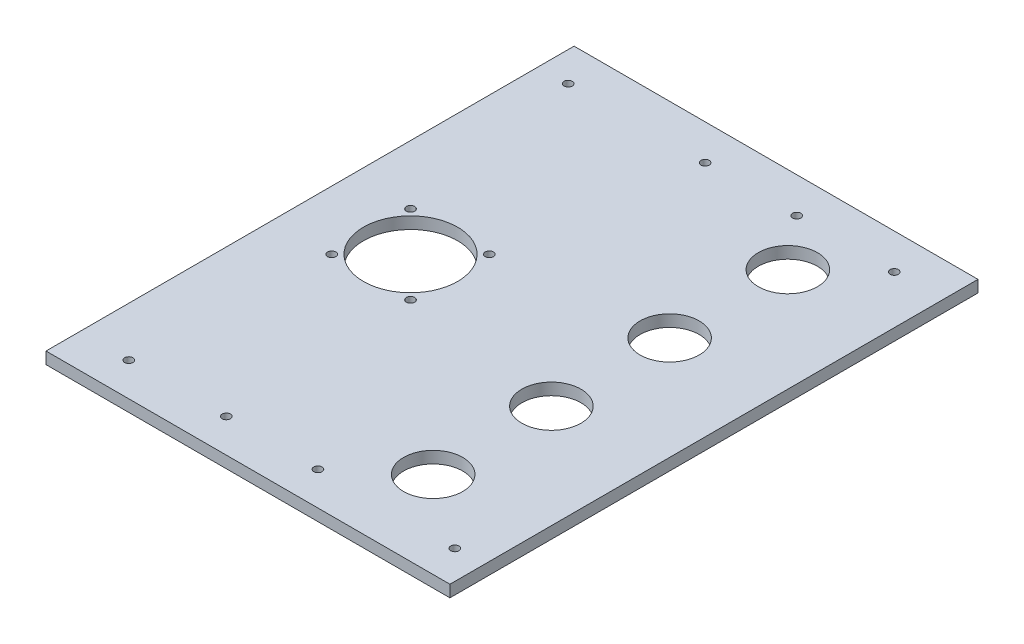
ISO-10303-21;
HEADER;
FILE_DESCRIPTION(('STEP AP214'),'2;1');
FILE_NAME('part.step','',(''),(''),'','','');
FILE_SCHEMA(('AUTOMOTIVE_DESIGN { 1 0 10303 214 1 1 1 1 }'));
ENDSEC;
DATA;
#1=APPLICATION_CONTEXT('core data for automotive mechanical design processes');
#2=APPLICATION_PROTOCOL_DEFINITION('international standard','automotive_design',2000,#1);
#3=PRODUCT_CONTEXT('',#1,'mechanical');
#4=PRODUCT('Part','Part','',(#3));
#5=PRODUCT_RELATED_PRODUCT_CATEGORY('part','',(#4));
#6=PRODUCT_DEFINITION_FORMATION('','',#4);
#7=PRODUCT_DEFINITION_CONTEXT('part definition',#1,'design');
#8=PRODUCT_DEFINITION('design','',#6,#7);
#9=PRODUCT_DEFINITION_SHAPE('','',#8);
#10=(LENGTH_UNIT() NAMED_UNIT(*) SI_UNIT(.MILLI.,.METRE.));
#11=(NAMED_UNIT(*) PLANE_ANGLE_UNIT() SI_UNIT($,.RADIAN.));
#12=(NAMED_UNIT(*) SI_UNIT($,.STERADIAN.) SOLID_ANGLE_UNIT());
#13=UNCERTAINTY_MEASURE_WITH_UNIT(LENGTH_MEASURE(1.E-05),#10,'distance_accuracy_value','');
#14=(GEOMETRIC_REPRESENTATION_CONTEXT(3) GLOBAL_UNCERTAINTY_ASSIGNED_CONTEXT((#13)) GLOBAL_UNIT_ASSIGNED_CONTEXT((#10,
#11,#12)) REPRESENTATION_CONTEXT('',''));
#15=CARTESIAN_POINT('',(0.,0.,0.));
#16=DIRECTION('',(0.,0.,1.));
#17=DIRECTION('',(1.,0.,0.));
#18=AXIS2_PLACEMENT_3D('',#15,#16,#17);
#19=CARTESIAN_POINT('',(102.5,6.,-134.));
#20=DIRECTION('',(1.,0.,0.));
#21=DIRECTION('',(0.,0.,-1.));
#22=AXIS2_PLACEMENT_3D('',#19,#20,#21);
#23=PLANE('',#22);
#24=DIRECTION('',(0.,0.,1.));
#25=VECTOR('',#24,1.);
#26=CARTESIAN_POINT('',(102.5,0.,-134.));
#27=LINE('',#26,#25);
#28=CARTESIAN_POINT('',(102.5,0.,-134.));
#29=VERTEX_POINT('',#28);
#30=CARTESIAN_POINT('',(102.5,0.,134.));
#31=VERTEX_POINT('',#30);
#32=EDGE_CURVE('E102',#29,#31,#27,.T.);
#33=ORIENTED_EDGE('',*,*,#32,.F.);
#34=DIRECTION('',(0.,-1.,0.));
#35=VECTOR('',#34,1.);
#36=CARTESIAN_POINT('',(102.5,6.,-134.));
#37=LINE('',#36,#35);
#38=CARTESIAN_POINT('',(102.5,6.,-134.));
#39=VERTEX_POINT('',#38);
#40=EDGE_CURVE('E11',#39,#29,#37,.T.);
#41=ORIENTED_EDGE('',*,*,#40,.F.);
#42=DIRECTION('',(0.,0.,1.));
#43=VECTOR('',#42,1.);
#44=CARTESIAN_POINT('',(102.5,6.,-134.));
#45=LINE('',#44,#43);
#46=CARTESIAN_POINT('',(102.5,6.,134.));
#47=VERTEX_POINT('',#46);
#48=EDGE_CURVE('E95',#39,#47,#45,.T.);
#49=ORIENTED_EDGE('',*,*,#48,.T.);
#50=DIRECTION('',(0.,-1.,0.));
#51=VECTOR('',#50,1.);
#52=CARTESIAN_POINT('',(102.5,6.,134.));
#53=LINE('',#52,#51);
#54=EDGE_CURVE('E40',#47,#31,#53,.T.);
#55=ORIENTED_EDGE('',*,*,#54,.T.);
#56=EDGE_LOOP('',(#33,#41,#49,#55));
#57=FACE_BOUND('',#56,.T.);
#58=ADVANCED_FACE('F37',(#57),#23,.T.);
#59=CARTESIAN_POINT('',(-102.5,6.,-134.));
#60=DIRECTION('',(0.,0.,-1.));
#61=DIRECTION('',(-1.,0.,0.));
#62=AXIS2_PLACEMENT_3D('',#59,#60,#61);
#63=PLANE('',#62);
#64=DIRECTION('',(1.,0.,0.));
#65=VECTOR('',#64,1.);
#66=CARTESIAN_POINT('',(-102.5,0.,-134.));
#67=LINE('',#66,#65);
#68=CARTESIAN_POINT('',(-102.5,0.,-134.));
#69=VERTEX_POINT('',#68);
#70=EDGE_CURVE('E97',#69,#29,#67,.T.);
#71=ORIENTED_EDGE('',*,*,#70,.F.);
#72=DIRECTION('',(0.,-1.,0.));
#73=VECTOR('',#72,1.);
#74=CARTESIAN_POINT('',(-102.5,6.,-134.));
#75=LINE('',#74,#73);
#76=CARTESIAN_POINT('',(-102.5,6.,-134.));
#77=VERTEX_POINT('',#76);
#78=EDGE_CURVE('E46',#77,#69,#75,.T.);
#79=ORIENTED_EDGE('',*,*,#78,.F.);
#80=DIRECTION('',(1.,0.,0.));
#81=VECTOR('',#80,1.);
#82=CARTESIAN_POINT('',(-102.5,6.,-134.));
#83=LINE('',#82,#81);
#84=EDGE_CURVE('E92',#77,#39,#83,.T.);
#85=ORIENTED_EDGE('',*,*,#84,.T.);
#86=ORIENTED_EDGE('',*,*,#40,.T.);
#87=EDGE_LOOP('',(#71,#79,#85,#86));
#88=FACE_BOUND('',#87,.T.);
#89=ADVANCED_FACE('F113',(#88),#63,.T.);
#90=CARTESIAN_POINT('',(-102.5,6.,-134.));
#91=DIRECTION('',(-1.,0.,0.));
#92=DIRECTION('',(0.,0.,1.));
#93=AXIS2_PLACEMENT_3D('',#90,#91,#92);
#94=PLANE('',#93);
#95=DIRECTION('',(0.,0.,-1.));
#96=VECTOR('',#95,1.);
#97=CARTESIAN_POINT('',(-102.5,0.,-134.));
#98=LINE('',#97,#96);
#99=CARTESIAN_POINT('',(-102.5,0.,134.));
#100=VERTEX_POINT('',#99);
#101=EDGE_CURVE('E87',#100,#69,#98,.T.);
#102=ORIENTED_EDGE('',*,*,#101,.F.);
#103=DIRECTION('',(0.,-1.,0.));
#104=VECTOR('',#103,1.);
#105=CARTESIAN_POINT('',(-102.5,6.,134.));
#106=LINE('',#105,#104);
#107=CARTESIAN_POINT('',(-102.5,6.,134.));
#108=VERTEX_POINT('',#107);
#109=EDGE_CURVE('E82',#108,#100,#106,.T.);
#110=ORIENTED_EDGE('',*,*,#109,.F.);
#111=DIRECTION('',(0.,0.,-1.));
#112=VECTOR('',#111,1.);
#113=CARTESIAN_POINT('',(-102.5,6.,-134.));
#114=LINE('',#113,#112);
#115=EDGE_CURVE('E85',#108,#77,#114,.T.);
#116=ORIENTED_EDGE('',*,*,#115,.T.);
#117=ORIENTED_EDGE('',*,*,#78,.T.);
#118=EDGE_LOOP('',(#102,#110,#116,#117));
#119=FACE_BOUND('',#118,.T.);
#120=ADVANCED_FACE('F84',(#119),#94,.T.);
#121=CARTESIAN_POINT('',(-102.5,6.,134.));
#122=DIRECTION('',(0.,0.,1.));
#123=DIRECTION('',(1.,0.,0.));
#124=AXIS2_PLACEMENT_3D('',#121,#122,#123);
#125=PLANE('',#124);
#126=DIRECTION('',(-1.,0.,0.));
#127=VECTOR('',#126,1.);
#128=CARTESIAN_POINT('',(-102.5,0.,134.));
#129=LINE('',#128,#127);
#130=EDGE_CURVE('E105',#31,#100,#129,.T.);
#131=ORIENTED_EDGE('',*,*,#130,.F.);
#132=ORIENTED_EDGE('',*,*,#54,.F.);
#133=DIRECTION('',(-1.,0.,0.));
#134=VECTOR('',#133,1.);
#135=CARTESIAN_POINT('',(-102.5,6.,134.));
#136=LINE('',#135,#134);
#137=EDGE_CURVE('E91',#47,#108,#136,.T.);
#138=ORIENTED_EDGE('',*,*,#137,.T.);
#139=ORIENTED_EDGE('',*,*,#109,.T.);
#140=EDGE_LOOP('',(#131,#132,#138,#139));
#141=FACE_BOUND('',#140,.T.);
#142=ADVANCED_FACE('F94',(#141),#125,.T.);
#143=CARTESIAN_POINT('',(0.,6.,0.));
#144=DIRECTION('',(0.,1.,0.));
#145=DIRECTION('',(0.,0.,1.));
#146=AXIS2_PLACEMENT_3D('',#143,#144,#145);
#147=PLANE('',#146);
#148=CARTESIAN_POINT('',(-87.5,6.,-115.999999999999));
#149=DIRECTION('',(0.,1.,0.));
#150=DIRECTION('',(0.,0.,1.));
#151=AXIS2_PLACEMENT_3D('',#148,#149,#150);
#152=CIRCLE('',#151,2.1);
#153=CARTESIAN_POINT('',(-87.5,6.,-113.899999999999));
#154=VERTEX_POINT('',#153);
#155=EDGE_CURVE('E209',#154,#154,#152,.T.);
#156=ORIENTED_EDGE('',*,*,#155,.F.);
#157=EDGE_LOOP('',(#156));
#158=FACE_BOUND('',#157,.T.);
#159=CARTESIAN_POINT('',(-18.,6.,-115.999999999999));
#160=DIRECTION('',(0.,1.,0.));
#161=DIRECTION('',(0.,0.,1.));
#162=AXIS2_PLACEMENT_3D('',#159,#160,#161);
#163=CIRCLE('',#162,2.1);
#164=CARTESIAN_POINT('',(-18.,6.,-113.899999999999));
#165=VERTEX_POINT('',#164);
#166=EDGE_CURVE('E211',#165,#165,#163,.T.);
#167=ORIENTED_EDGE('',*,*,#166,.F.);
#168=EDGE_LOOP('',(#167));
#169=FACE_BOUND('',#168,.T.);
#170=CARTESIAN_POINT('',(28.5,6.,-116.));
#171=DIRECTION('',(0.,1.,0.));
#172=DIRECTION('',(0.,0.,1.));
#173=AXIS2_PLACEMENT_3D('',#170,#171,#172);
#174=CIRCLE('',#173,2.1);
#175=CARTESIAN_POINT('',(28.5,6.,-113.9));
#176=VERTEX_POINT('',#175);
#177=EDGE_CURVE('E219',#176,#176,#174,.T.);
#178=ORIENTED_EDGE('',*,*,#177,.F.);
#179=EDGE_LOOP('',(#178));
#180=FACE_BOUND('',#179,.T.);
#181=CARTESIAN_POINT('',(78.,6.,-116.));
#182=DIRECTION('',(0.,1.,0.));
#183=DIRECTION('',(0.,0.,1.));
#184=AXIS2_PLACEMENT_3D('',#181,#182,#183);
#185=CIRCLE('',#184,2.1);
#186=CARTESIAN_POINT('',(78.,6.,-113.9));
#187=VERTEX_POINT('',#186);
#188=EDGE_CURVE('E225',#187,#187,#185,.T.);
#189=ORIENTED_EDGE('',*,*,#188,.F.);
#190=EDGE_LOOP('',(#189));
#191=FACE_BOUND('',#190,.T.);
#192=CARTESIAN_POINT('',(-77.5,6.,117.));
#193=DIRECTION('',(0.,1.,0.));
#194=DIRECTION('',(0.,0.,1.));
#195=AXIS2_PLACEMENT_3D('',#192,#193,#194);
#196=CIRCLE('',#195,2.1);
#197=CARTESIAN_POINT('',(-77.5,6.,119.1));
#198=VERTEX_POINT('',#197);
#199=EDGE_CURVE('E231',#198,#198,#196,.T.);
#200=ORIENTED_EDGE('',*,*,#199,.F.);
#201=EDGE_LOOP('',(#200));
#202=FACE_BOUND('',#201,.T.);
#203=CARTESIAN_POINT('',(-28.,6.,117.));
#204=DIRECTION('',(0.,1.,0.));
#205=DIRECTION('',(0.,0.,1.));
#206=AXIS2_PLACEMENT_3D('',#203,#204,#205);
#207=CIRCLE('',#206,2.1);
#208=CARTESIAN_POINT('',(-28.,6.,119.1));
#209=VERTEX_POINT('',#208);
#210=EDGE_CURVE('E237',#209,#209,#207,.T.);
#211=ORIENTED_EDGE('',*,*,#210,.F.);
#212=EDGE_LOOP('',(#211));
#213=FACE_BOUND('',#212,.T.);
#214=CARTESIAN_POINT('',(18.5,6.,116.999999999985));
#215=DIRECTION('',(0.,1.,0.));
#216=DIRECTION('',(0.,0.,1.));
#217=AXIS2_PLACEMENT_3D('',#214,#215,#216);
#218=CIRCLE('',#217,2.1);
#219=CARTESIAN_POINT('',(18.5,6.,119.099999999985));
#220=VERTEX_POINT('',#219);
#221=EDGE_CURVE('E243',#220,#220,#218,.T.);
#222=ORIENTED_EDGE('',*,*,#221,.F.);
#223=EDGE_LOOP('',(#222));
#224=FACE_BOUND('',#223,.T.);
#225=CARTESIAN_POINT('',(88.,6.,116.999999999984));
#226=DIRECTION('',(0.,1.,0.));
#227=DIRECTION('',(0.,0.,1.));
#228=AXIS2_PLACEMENT_3D('',#225,#226,#227);
#229=CIRCLE('',#228,2.1);
#230=CARTESIAN_POINT('',(88.,6.,119.099999999984));
#231=VERTEX_POINT('',#230);
#232=EDGE_CURVE('E249',#231,#231,#229,.T.);
#233=ORIENTED_EDGE('',*,*,#232,.F.);
#234=EDGE_LOOP('',(#233));
#235=FACE_BOUND('',#234,.T.);
#236=CARTESIAN_POINT('',(50.,6.,90.));
#237=DIRECTION('',(0.,1.,0.));
#238=DIRECTION('',(0.,0.,1.));
#239=AXIS2_PLACEMENT_3D('',#236,#237,#238);
#240=CIRCLE('',#239,15.);
#241=CARTESIAN_POINT('',(50.,6.,105.));
#242=VERTEX_POINT('',#241);
#243=EDGE_CURVE('E269',#242,#242,#240,.T.);
#244=ORIENTED_EDGE('',*,*,#243,.F.);
#245=EDGE_LOOP('',(#244));
#246=FACE_BOUND('',#245,.T.);
#247=CARTESIAN_POINT('',(50.,6.,-90.));
#248=DIRECTION('',(0.,1.,0.));
#249=DIRECTION('',(0.,0.,1.));
#250=AXIS2_PLACEMENT_3D('',#247,#248,#249);
#251=CIRCLE('',#250,15.);
#252=CARTESIAN_POINT('',(50.,6.,-75.));
#253=VERTEX_POINT('',#252);
#254=EDGE_CURVE('E263',#253,#253,#251,.T.);
#255=ORIENTED_EDGE('',*,*,#254,.F.);
#256=EDGE_LOOP('',(#255));
#257=FACE_BOUND('',#256,.T.);
#258=CARTESIAN_POINT('',(50.,6.,30.));
#259=DIRECTION('',(0.,1.,0.));
#260=DIRECTION('',(0.,0.,1.));
#261=AXIS2_PLACEMENT_3D('',#258,#259,#260);
#262=CIRCLE('',#261,15.);
#263=CARTESIAN_POINT('',(50.,6.,45.));
#264=VERTEX_POINT('',#263);
#265=EDGE_CURVE('E256',#264,#264,#262,.T.);
#266=ORIENTED_EDGE('',*,*,#265,.F.);
#267=EDGE_LOOP('',(#266));
#268=FACE_BOUND('',#267,.T.);
#269=CARTESIAN_POINT('',(50.,6.,-30.));
#270=DIRECTION('',(0.,1.,0.));
#271=DIRECTION('',(0.,0.,1.));
#272=AXIS2_PLACEMENT_3D('',#269,#270,#271);
#273=CIRCLE('',#272,15.);
#274=CARTESIAN_POINT('',(50.,6.,-15.));
#275=VERTEX_POINT('',#274);
#276=EDGE_CURVE('E259',#275,#275,#273,.T.);
#277=ORIENTED_EDGE('',*,*,#276,.F.);
#278=EDGE_LOOP('',(#277));
#279=FACE_BOUND('',#278,.T.);
#280=CARTESIAN_POINT('',(-52.5,6.,-1.));
#281=DIRECTION('',(0.,1.,0.));
#282=DIRECTION('',(0.,0.,1.));
#283=AXIS2_PLACEMENT_3D('',#280,#281,#282);
#284=CIRCLE('',#283,23.9000000000055);
#285=CARTESIAN_POINT('',(-52.5,6.,22.9000000000055));
#286=VERTEX_POINT('',#285);
#287=EDGE_CURVE('E292',#286,#286,#284,.T.);
#288=ORIENTED_EDGE('',*,*,#287,.F.);
#289=EDGE_LOOP('',(#288));
#290=FACE_BOUND('',#289,.T.);
#291=CARTESIAN_POINT('',(-32.4999999999924,6.,-21.));
#292=DIRECTION('',(0.,1.,0.));
#293=DIRECTION('',(0.,0.,1.));
#294=AXIS2_PLACEMENT_3D('',#291,#292,#293);
#295=CIRCLE('',#294,2.10000000000077);
#296=CARTESIAN_POINT('',(-32.4999999999924,6.,-18.8999999999992));
#297=VERTEX_POINT('',#296);
#298=EDGE_CURVE('E298',#297,#297,#295,.T.);
#299=ORIENTED_EDGE('',*,*,#298,.F.);
#300=EDGE_LOOP('',(#299));
#301=FACE_BOUND('',#300,.T.);
#302=CARTESIAN_POINT('',(-32.4999999999924,6.,19.));
#303=DIRECTION('',(0.,1.,0.));
#304=DIRECTION('',(0.,0.,1.));
#305=AXIS2_PLACEMENT_3D('',#302,#303,#304);
#306=CIRCLE('',#305,2.10000000000063);
#307=CARTESIAN_POINT('',(-32.4999999999924,6.,21.1000000000006));
#308=VERTEX_POINT('',#307);
#309=EDGE_CURVE('E280',#308,#308,#306,.T.);
#310=ORIENTED_EDGE('',*,*,#309,.F.);
#311=EDGE_LOOP('',(#310));
#312=FACE_BOUND('',#311,.T.);
#313=CARTESIAN_POINT('',(-72.4999999999927,6.,19.));
#314=DIRECTION('',(0.,1.,0.));
#315=DIRECTION('',(0.,0.,1.));
#316=AXIS2_PLACEMENT_3D('',#313,#314,#315);
#317=CIRCLE('',#316,2.10000000000077);
#318=CARTESIAN_POINT('',(-72.4999999999927,6.,21.1000000000008));
#319=VERTEX_POINT('',#318);
#320=EDGE_CURVE('E287',#319,#319,#317,.T.);
#321=ORIENTED_EDGE('',*,*,#320,.F.);
#322=EDGE_LOOP('',(#321));
#323=FACE_BOUND('',#322,.T.);
#324=CARTESIAN_POINT('',(-72.4999999999927,6.,-21.));
#325=DIRECTION('',(0.,1.,0.));
#326=DIRECTION('',(0.,0.,1.));
#327=AXIS2_PLACEMENT_3D('',#324,#325,#326);
#328=CIRCLE('',#327,2.10000000000077);
#329=CARTESIAN_POINT('',(-72.4999999999927,6.,-18.8999999999992));
#330=VERTEX_POINT('',#329);
#331=EDGE_CURVE('E301',#330,#330,#328,.T.);
#332=ORIENTED_EDGE('',*,*,#331,.F.);
#333=EDGE_LOOP('',(#332));
#334=FACE_BOUND('',#333,.T.);
#335=ORIENTED_EDGE('',*,*,#48,.F.);
#336=ORIENTED_EDGE('',*,*,#84,.F.);
#337=ORIENTED_EDGE('',*,*,#115,.F.);
#338=ORIENTED_EDGE('',*,*,#137,.F.);
#339=EDGE_LOOP('',(#335,#336,#337,#338));
#340=FACE_BOUND('',#339,.T.);
#341=ADVANCED_FACE('F90',(#158,#169,#180,#191,#202,#213,#224,#235,#246,#257,#268,#279,#290,#301,
#312,#323,#334,#340),#147,.T.);
#342=CARTESIAN_POINT('',(0.,0.,0.));
#343=DIRECTION('',(0.,1.,0.));
#344=DIRECTION('',(0.,0.,1.));
#345=AXIS2_PLACEMENT_3D('',#342,#343,#344);
#346=PLANE('',#345);
#347=CARTESIAN_POINT('',(-87.5,0.,-115.999999999999));
#348=DIRECTION('',(0.,1.,0.));
#349=DIRECTION('',(0.,0.,1.));
#350=AXIS2_PLACEMENT_3D('',#347,#348,#349);
#351=CIRCLE('',#350,2.1);
#352=CARTESIAN_POINT('',(-87.5,0.,-113.899999999999));
#353=VERTEX_POINT('',#352);
#354=EDGE_CURVE('E207',#353,#353,#351,.T.);
#355=ORIENTED_EDGE('',*,*,#354,.T.);
#356=EDGE_LOOP('',(#355));
#357=FACE_BOUND('',#356,.T.);
#358=CARTESIAN_POINT('',(-18.,0.,-115.999999999999));
#359=DIRECTION('',(0.,1.,0.));
#360=DIRECTION('',(0.,0.,1.));
#361=AXIS2_PLACEMENT_3D('',#358,#359,#360);
#362=CIRCLE('',#361,2.1);
#363=CARTESIAN_POINT('',(-18.,0.,-113.899999999999));
#364=VERTEX_POINT('',#363);
#365=EDGE_CURVE('E216',#364,#364,#362,.T.);
#366=ORIENTED_EDGE('',*,*,#365,.T.);
#367=EDGE_LOOP('',(#366));
#368=FACE_BOUND('',#367,.T.);
#369=CARTESIAN_POINT('',(28.5,0.,-116.));
#370=DIRECTION('',(0.,1.,0.));
#371=DIRECTION('',(0.,0.,1.));
#372=AXIS2_PLACEMENT_3D('',#369,#370,#371);
#373=CIRCLE('',#372,2.1);
#374=CARTESIAN_POINT('',(28.5,0.,-113.9));
#375=VERTEX_POINT('',#374);
#376=EDGE_CURVE('E222',#375,#375,#373,.T.);
#377=ORIENTED_EDGE('',*,*,#376,.T.);
#378=EDGE_LOOP('',(#377));
#379=FACE_BOUND('',#378,.T.);
#380=CARTESIAN_POINT('',(78.,0.,-116.));
#381=DIRECTION('',(0.,1.,0.));
#382=DIRECTION('',(0.,0.,1.));
#383=AXIS2_PLACEMENT_3D('',#380,#381,#382);
#384=CIRCLE('',#383,2.1);
#385=CARTESIAN_POINT('',(78.,0.,-113.9));
#386=VERTEX_POINT('',#385);
#387=EDGE_CURVE('E228',#386,#386,#384,.T.);
#388=ORIENTED_EDGE('',*,*,#387,.T.);
#389=EDGE_LOOP('',(#388));
#390=FACE_BOUND('',#389,.T.);
#391=CARTESIAN_POINT('',(-77.5,0.,117.));
#392=DIRECTION('',(0.,1.,0.));
#393=DIRECTION('',(0.,0.,1.));
#394=AXIS2_PLACEMENT_3D('',#391,#392,#393);
#395=CIRCLE('',#394,2.1);
#396=CARTESIAN_POINT('',(-77.5,0.,119.1));
#397=VERTEX_POINT('',#396);
#398=EDGE_CURVE('E234',#397,#397,#395,.T.);
#399=ORIENTED_EDGE('',*,*,#398,.T.);
#400=EDGE_LOOP('',(#399));
#401=FACE_BOUND('',#400,.T.);
#402=CARTESIAN_POINT('',(-28.,0.,117.));
#403=DIRECTION('',(0.,1.,0.));
#404=DIRECTION('',(0.,0.,1.));
#405=AXIS2_PLACEMENT_3D('',#402,#403,#404);
#406=CIRCLE('',#405,2.1);
#407=CARTESIAN_POINT('',(-28.,0.,119.1));
#408=VERTEX_POINT('',#407);
#409=EDGE_CURVE('E240',#408,#408,#406,.T.);
#410=ORIENTED_EDGE('',*,*,#409,.T.);
#411=EDGE_LOOP('',(#410));
#412=FACE_BOUND('',#411,.T.);
#413=CARTESIAN_POINT('',(18.5,0.,116.999999999985));
#414=DIRECTION('',(0.,1.,0.));
#415=DIRECTION('',(0.,0.,1.));
#416=AXIS2_PLACEMENT_3D('',#413,#414,#415);
#417=CIRCLE('',#416,2.1);
#418=CARTESIAN_POINT('',(18.5,0.,119.099999999985));
#419=VERTEX_POINT('',#418);
#420=EDGE_CURVE('E246',#419,#419,#417,.T.);
#421=ORIENTED_EDGE('',*,*,#420,.T.);
#422=EDGE_LOOP('',(#421));
#423=FACE_BOUND('',#422,.T.);
#424=CARTESIAN_POINT('',(88.,0.,116.999999999984));
#425=DIRECTION('',(0.,1.,0.));
#426=DIRECTION('',(0.,0.,1.));
#427=AXIS2_PLACEMENT_3D('',#424,#425,#426);
#428=CIRCLE('',#427,2.1);
#429=CARTESIAN_POINT('',(88.,0.,119.099999999984));
#430=VERTEX_POINT('',#429);
#431=EDGE_CURVE('E252',#430,#430,#428,.T.);
#432=ORIENTED_EDGE('',*,*,#431,.T.);
#433=EDGE_LOOP('',(#432));
#434=FACE_BOUND('',#433,.T.);
#435=CARTESIAN_POINT('',(50.,0.,90.));
#436=DIRECTION('',(0.,1.,0.));
#437=DIRECTION('',(0.,0.,1.));
#438=AXIS2_PLACEMENT_3D('',#435,#436,#437);
#439=CIRCLE('',#438,15.);
#440=CARTESIAN_POINT('',(50.,0.,105.));
#441=VERTEX_POINT('',#440);
#442=EDGE_CURVE('E255',#441,#441,#439,.T.);
#443=ORIENTED_EDGE('',*,*,#442,.T.);
#444=EDGE_LOOP('',(#443));
#445=FACE_BOUND('',#444,.T.);
#446=CARTESIAN_POINT('',(50.,0.,-90.));
#447=DIRECTION('',(0.,1.,0.));
#448=DIRECTION('',(0.,0.,1.));
#449=AXIS2_PLACEMENT_3D('',#446,#447,#448);
#450=CIRCLE('',#449,15.);
#451=CARTESIAN_POINT('',(50.,0.,-75.));
#452=VERTEX_POINT('',#451);
#453=EDGE_CURVE('E266',#452,#452,#450,.T.);
#454=ORIENTED_EDGE('',*,*,#453,.T.);
#455=EDGE_LOOP('',(#454));
#456=FACE_BOUND('',#455,.T.);
#457=CARTESIAN_POINT('',(50.,0.,30.));
#458=DIRECTION('',(0.,1.,0.));
#459=DIRECTION('',(0.,0.,1.));
#460=AXIS2_PLACEMENT_3D('',#457,#458,#459);
#461=CIRCLE('',#460,15.);
#462=CARTESIAN_POINT('',(50.,0.,45.));
#463=VERTEX_POINT('',#462);
#464=EDGE_CURVE('E260',#463,#463,#461,.T.);
#465=ORIENTED_EDGE('',*,*,#464,.T.);
#466=EDGE_LOOP('',(#465));
#467=FACE_BOUND('',#466,.T.);
#468=CARTESIAN_POINT('',(50.,0.,-30.));
#469=DIRECTION('',(0.,1.,0.));
#470=DIRECTION('',(0.,0.,1.));
#471=AXIS2_PLACEMENT_3D('',#468,#469,#470);
#472=CIRCLE('',#471,15.);
#473=CARTESIAN_POINT('',(50.,0.,-15.));
#474=VERTEX_POINT('',#473);
#475=EDGE_CURVE('E274',#474,#474,#472,.T.);
#476=ORIENTED_EDGE('',*,*,#475,.T.);
#477=EDGE_LOOP('',(#476));
#478=FACE_BOUND('',#477,.T.);
#479=CARTESIAN_POINT('',(-52.5,0.,-1.));
#480=DIRECTION('',(0.,1.,0.));
#481=DIRECTION('',(0.,0.,1.));
#482=AXIS2_PLACEMENT_3D('',#479,#480,#481);
#483=CIRCLE('',#482,23.9000000000055);
#484=CARTESIAN_POINT('',(-52.5,0.,22.9000000000055));
#485=VERTEX_POINT('',#484);
#486=EDGE_CURVE('E283',#485,#485,#483,.T.);
#487=ORIENTED_EDGE('',*,*,#486,.T.);
#488=EDGE_LOOP('',(#487));
#489=FACE_BOUND('',#488,.T.);
#490=CARTESIAN_POINT('',(-32.4999999999924,0.,-21.));
#491=DIRECTION('',(0.,1.,0.));
#492=DIRECTION('',(0.,0.,1.));
#493=AXIS2_PLACEMENT_3D('',#490,#491,#492);
#494=CIRCLE('',#493,2.10000000000077);
#495=CARTESIAN_POINT('',(-32.4999999999924,0.,-18.8999999999992));
#496=VERTEX_POINT('',#495);
#497=EDGE_CURVE('E295',#496,#496,#494,.T.);
#498=ORIENTED_EDGE('',*,*,#497,.T.);
#499=EDGE_LOOP('',(#498));
#500=FACE_BOUND('',#499,.T.);
#501=CARTESIAN_POINT('',(-32.4999999999924,0.,19.));
#502=DIRECTION('',(0.,1.,0.));
#503=DIRECTION('',(0.,0.,1.));
#504=AXIS2_PLACEMENT_3D('',#501,#502,#503);
#505=CIRCLE('',#504,2.10000000000063);
#506=CARTESIAN_POINT('',(-32.4999999999924,0.,21.1000000000006));
#507=VERTEX_POINT('',#506);
#508=EDGE_CURVE('E284',#507,#507,#505,.T.);
#509=ORIENTED_EDGE('',*,*,#508,.T.);
#510=EDGE_LOOP('',(#509));
#511=FACE_BOUND('',#510,.T.);
#512=CARTESIAN_POINT('',(-72.4999999999927,0.,19.));
#513=DIRECTION('',(0.,1.,0.));
#514=DIRECTION('',(0.,0.,1.));
#515=AXIS2_PLACEMENT_3D('',#512,#513,#514);
#516=CIRCLE('',#515,2.10000000000077);
#517=CARTESIAN_POINT('',(-72.4999999999927,0.,21.1000000000008));
#518=VERTEX_POINT('',#517);
#519=EDGE_CURVE('E277',#518,#518,#516,.T.);
#520=ORIENTED_EDGE('',*,*,#519,.T.);
#521=EDGE_LOOP('',(#520));
#522=FACE_BOUND('',#521,.T.);
#523=CARTESIAN_POINT('',(-72.4999999999927,0.,-21.));
#524=DIRECTION('',(0.,1.,0.));
#525=DIRECTION('',(0.,0.,1.));
#526=AXIS2_PLACEMENT_3D('',#523,#524,#525);
#527=CIRCLE('',#526,2.10000000000077);
#528=CARTESIAN_POINT('',(-72.4999999999927,0.,-18.8999999999992));
#529=VERTEX_POINT('',#528);
#530=EDGE_CURVE('E106',#529,#529,#527,.T.);
#531=ORIENTED_EDGE('',*,*,#530,.T.);
#532=EDGE_LOOP('',(#531));
#533=FACE_BOUND('',#532,.T.);
#534=ORIENTED_EDGE('',*,*,#32,.T.);
#535=ORIENTED_EDGE('',*,*,#130,.T.);
#536=ORIENTED_EDGE('',*,*,#101,.T.);
#537=ORIENTED_EDGE('',*,*,#70,.T.);
#538=EDGE_LOOP('',(#534,#535,#536,#537));
#539=FACE_BOUND('',#538,.T.);
#540=ADVANCED_FACE('F112',(#357,#368,#379,#390,#401,#412,#423,#434,#445,#456,#467,#478,#489,
#500,#511,#522,#533,#539),#346,.F.);
#541=CARTESIAN_POINT('',(-72.4999999999927,0.,-21.));
#542=DIRECTION('',(0.,1.,0.));
#543=DIRECTION('',(0.,0.,1.));
#544=AXIS2_PLACEMENT_3D('',#541,#542,#543);
#545=CYLINDRICAL_SURFACE('',#544,2.10000000000077);
#546=ORIENTED_EDGE('',*,*,#530,.F.);
#547=EDGE_LOOP('',(#546));
#548=FACE_BOUND('',#547,.T.);
#549=ORIENTED_EDGE('',*,*,#331,.T.);
#550=EDGE_LOOP('',(#549));
#551=FACE_BOUND('',#550,.T.);
#552=ADVANCED_FACE('F131',(#548,#551),#545,.F.);
#553=CARTESIAN_POINT('',(-72.4999999999927,0.,19.));
#554=DIRECTION('',(0.,1.,0.));
#555=DIRECTION('',(0.,0.,1.));
#556=AXIS2_PLACEMENT_3D('',#553,#554,#555);
#557=CYLINDRICAL_SURFACE('',#556,2.10000000000077);
#558=ORIENTED_EDGE('',*,*,#519,.F.);
#559=EDGE_LOOP('',(#558));
#560=FACE_BOUND('',#559,.T.);
#561=ORIENTED_EDGE('',*,*,#320,.T.);
#562=EDGE_LOOP('',(#561));
#563=FACE_BOUND('',#562,.T.);
#564=ADVANCED_FACE('F138',(#560,#563),#557,.F.);
#565=CARTESIAN_POINT('',(-32.4999999999924,0.,19.));
#566=DIRECTION('',(0.,1.,0.));
#567=DIRECTION('',(0.,0.,1.));
#568=AXIS2_PLACEMENT_3D('',#565,#566,#567);
#569=CYLINDRICAL_SURFACE('',#568,2.10000000000063);
#570=ORIENTED_EDGE('',*,*,#508,.F.);
#571=EDGE_LOOP('',(#570));
#572=FACE_BOUND('',#571,.T.);
#573=ORIENTED_EDGE('',*,*,#309,.T.);
#574=EDGE_LOOP('',(#573));
#575=FACE_BOUND('',#574,.T.);
#576=ADVANCED_FACE('F144',(#572,#575),#569,.F.);
#577=CARTESIAN_POINT('',(-32.4999999999924,0.,-21.));
#578=DIRECTION('',(0.,1.,0.));
#579=DIRECTION('',(0.,0.,1.));
#580=AXIS2_PLACEMENT_3D('',#577,#578,#579);
#581=CYLINDRICAL_SURFACE('',#580,2.10000000000077);
#582=ORIENTED_EDGE('',*,*,#497,.F.);
#583=EDGE_LOOP('',(#582));
#584=FACE_BOUND('',#583,.T.);
#585=ORIENTED_EDGE('',*,*,#298,.T.);
#586=EDGE_LOOP('',(#585));
#587=FACE_BOUND('',#586,.T.);
#588=ADVANCED_FACE('F140',(#584,#587),#581,.F.);
#589=CARTESIAN_POINT('',(-52.5,0.,-1.));
#590=DIRECTION('',(0.,1.,0.));
#591=DIRECTION('',(0.,0.,1.));
#592=AXIS2_PLACEMENT_3D('',#589,#590,#591);
#593=CYLINDRICAL_SURFACE('',#592,23.9000000000055);
#594=ORIENTED_EDGE('',*,*,#486,.F.);
#595=EDGE_LOOP('',(#594));
#596=FACE_BOUND('',#595,.T.);
#597=ORIENTED_EDGE('',*,*,#287,.T.);
#598=EDGE_LOOP('',(#597));
#599=FACE_BOUND('',#598,.T.);
#600=ADVANCED_FACE('F143',(#596,#599),#593,.F.);
#601=CARTESIAN_POINT('',(50.,0.,-30.));
#602=DIRECTION('',(0.,1.,0.));
#603=DIRECTION('',(0.,0.,1.));
#604=AXIS2_PLACEMENT_3D('',#601,#602,#603);
#605=CYLINDRICAL_SURFACE('',#604,15.);
#606=ORIENTED_EDGE('',*,*,#475,.F.);
#607=EDGE_LOOP('',(#606));
#608=FACE_BOUND('',#607,.T.);
#609=ORIENTED_EDGE('',*,*,#276,.T.);
#610=EDGE_LOOP('',(#609));
#611=FACE_BOUND('',#610,.T.);
#612=ADVANCED_FACE('F148',(#608,#611),#605,.F.);
#613=CARTESIAN_POINT('',(50.,0.,30.));
#614=DIRECTION('',(0.,1.,0.));
#615=DIRECTION('',(0.,0.,1.));
#616=AXIS2_PLACEMENT_3D('',#613,#614,#615);
#617=CYLINDRICAL_SURFACE('',#616,15.);
#618=ORIENTED_EDGE('',*,*,#464,.F.);
#619=EDGE_LOOP('',(#618));
#620=FACE_BOUND('',#619,.T.);
#621=ORIENTED_EDGE('',*,*,#265,.T.);
#622=EDGE_LOOP('',(#621));
#623=FACE_BOUND('',#622,.T.);
#624=ADVANCED_FACE('F158',(#620,#623),#617,.F.);
#625=CARTESIAN_POINT('',(50.,0.,-90.));
#626=DIRECTION('',(0.,1.,0.));
#627=DIRECTION('',(0.,0.,1.));
#628=AXIS2_PLACEMENT_3D('',#625,#626,#627);
#629=CYLINDRICAL_SURFACE('',#628,15.);
#630=ORIENTED_EDGE('',*,*,#453,.F.);
#631=EDGE_LOOP('',(#630));
#632=FACE_BOUND('',#631,.T.);
#633=ORIENTED_EDGE('',*,*,#254,.T.);
#634=EDGE_LOOP('',(#633));
#635=FACE_BOUND('',#634,.T.);
#636=ADVANCED_FACE('F164',(#632,#635),#629,.F.);
#637=CARTESIAN_POINT('',(50.,0.,90.));
#638=DIRECTION('',(0.,1.,0.));
#639=DIRECTION('',(0.,0.,1.));
#640=AXIS2_PLACEMENT_3D('',#637,#638,#639);
#641=CYLINDRICAL_SURFACE('',#640,15.);
#642=ORIENTED_EDGE('',*,*,#442,.F.);
#643=EDGE_LOOP('',(#642));
#644=FACE_BOUND('',#643,.T.);
#645=ORIENTED_EDGE('',*,*,#243,.T.);
#646=EDGE_LOOP('',(#645));
#647=FACE_BOUND('',#646,.T.);
#648=ADVANCED_FACE('F160',(#644,#647),#641,.F.);
#649=CARTESIAN_POINT('',(88.,6.,116.999999999984));
#650=DIRECTION('',(0.,1.,0.));
#651=DIRECTION('',(0.,0.,1.));
#652=AXIS2_PLACEMENT_3D('',#649,#650,#651);
#653=CYLINDRICAL_SURFACE('',#652,2.1);
#654=ORIENTED_EDGE('',*,*,#431,.F.);
#655=EDGE_LOOP('',(#654));
#656=FACE_BOUND('',#655,.T.);
#657=ORIENTED_EDGE('',*,*,#232,.T.);
#658=EDGE_LOOP('',(#657));
#659=FACE_BOUND('',#658,.T.);
#660=ADVANCED_FACE('F163',(#656,#659),#653,.F.);
#661=CARTESIAN_POINT('',(18.5,6.,116.999999999985));
#662=DIRECTION('',(0.,1.,0.));
#663=DIRECTION('',(0.,0.,1.));
#664=AXIS2_PLACEMENT_3D('',#661,#662,#663);
#665=CYLINDRICAL_SURFACE('',#664,2.1);
#666=ORIENTED_EDGE('',*,*,#420,.F.);
#667=EDGE_LOOP('',(#666));
#668=FACE_BOUND('',#667,.T.);
#669=ORIENTED_EDGE('',*,*,#221,.T.);
#670=EDGE_LOOP('',(#669));
#671=FACE_BOUND('',#670,.T.);
#672=ADVANCED_FACE('F174',(#668,#671),#665,.F.);
#673=CARTESIAN_POINT('',(-28.,6.,117.));
#674=DIRECTION('',(0.,1.,0.));
#675=DIRECTION('',(0.,0.,1.));
#676=AXIS2_PLACEMENT_3D('',#673,#674,#675);
#677=CYLINDRICAL_SURFACE('',#676,2.1);
#678=ORIENTED_EDGE('',*,*,#409,.F.);
#679=EDGE_LOOP('',(#678));
#680=FACE_BOUND('',#679,.T.);
#681=ORIENTED_EDGE('',*,*,#210,.T.);
#682=EDGE_LOOP('',(#681));
#683=FACE_BOUND('',#682,.T.);
#684=ADVANCED_FACE('F178',(#680,#683),#677,.F.);
#685=CARTESIAN_POINT('',(-77.5,6.,117.));
#686=DIRECTION('',(0.,1.,0.));
#687=DIRECTION('',(0.,0.,1.));
#688=AXIS2_PLACEMENT_3D('',#685,#686,#687);
#689=CYLINDRICAL_SURFACE('',#688,2.1);
#690=ORIENTED_EDGE('',*,*,#398,.F.);
#691=EDGE_LOOP('',(#690));
#692=FACE_BOUND('',#691,.T.);
#693=ORIENTED_EDGE('',*,*,#199,.T.);
#694=EDGE_LOOP('',(#693));
#695=FACE_BOUND('',#694,.T.);
#696=ADVANCED_FACE('F182',(#692,#695),#689,.F.);
#697=CARTESIAN_POINT('',(78.,6.,-116.));
#698=DIRECTION('',(0.,1.,0.));
#699=DIRECTION('',(0.,0.,1.));
#700=AXIS2_PLACEMENT_3D('',#697,#698,#699);
#701=CYLINDRICAL_SURFACE('',#700,2.1);
#702=ORIENTED_EDGE('',*,*,#387,.F.);
#703=EDGE_LOOP('',(#702));
#704=FACE_BOUND('',#703,.T.);
#705=ORIENTED_EDGE('',*,*,#188,.T.);
#706=EDGE_LOOP('',(#705));
#707=FACE_BOUND('',#706,.T.);
#708=ADVANCED_FACE('F186',(#704,#707),#701,.F.);
#709=CARTESIAN_POINT('',(28.5,6.,-116.));
#710=DIRECTION('',(0.,1.,0.));
#711=DIRECTION('',(0.,0.,1.));
#712=AXIS2_PLACEMENT_3D('',#709,#710,#711);
#713=CYLINDRICAL_SURFACE('',#712,2.1);
#714=ORIENTED_EDGE('',*,*,#376,.F.);
#715=EDGE_LOOP('',(#714));
#716=FACE_BOUND('',#715,.T.);
#717=ORIENTED_EDGE('',*,*,#177,.T.);
#718=EDGE_LOOP('',(#717));
#719=FACE_BOUND('',#718,.T.);
#720=ADVANCED_FACE('F190',(#716,#719),#713,.F.);
#721=CARTESIAN_POINT('',(-18.,6.,-115.999999999999));
#722=DIRECTION('',(0.,1.,0.));
#723=DIRECTION('',(0.,0.,1.));
#724=AXIS2_PLACEMENT_3D('',#721,#722,#723);
#725=CYLINDRICAL_SURFACE('',#724,2.1);
#726=ORIENTED_EDGE('',*,*,#365,.F.);
#727=EDGE_LOOP('',(#726));
#728=FACE_BOUND('',#727,.T.);
#729=ORIENTED_EDGE('',*,*,#166,.T.);
#730=EDGE_LOOP('',(#729));
#731=FACE_BOUND('',#730,.T.);
#732=ADVANCED_FACE('F194',(#728,#731),#725,.F.);
#733=CARTESIAN_POINT('',(-87.5,6.,-115.999999999999));
#734=DIRECTION('',(0.,1.,0.));
#735=DIRECTION('',(0.,0.,1.));
#736=AXIS2_PLACEMENT_3D('',#733,#734,#735);
#737=CYLINDRICAL_SURFACE('',#736,2.1);
#738=ORIENTED_EDGE('',*,*,#354,.F.);
#739=EDGE_LOOP('',(#738));
#740=FACE_BOUND('',#739,.T.);
#741=ORIENTED_EDGE('',*,*,#155,.T.);
#742=EDGE_LOOP('',(#741));
#743=FACE_BOUND('',#742,.T.);
#744=ADVANCED_FACE('F198',(#740,#743),#737,.F.);
#745=CLOSED_SHELL('',(#58,#89,#120,#142,#341,#540,#552,#564,#576,#588,#600,#612,#624,#636,#648,
#660,#672,#684,#696,#708,#720,#732,#744));
#746=MANIFOLD_SOLID_BREP('B2',#745);
#747=ADVANCED_BREP_SHAPE_REPRESENTATION('',(#18,#746),#14);
#748=SHAPE_DEFINITION_REPRESENTATION(#9,#747);
ENDSEC;
END-ISO-10303-21;
